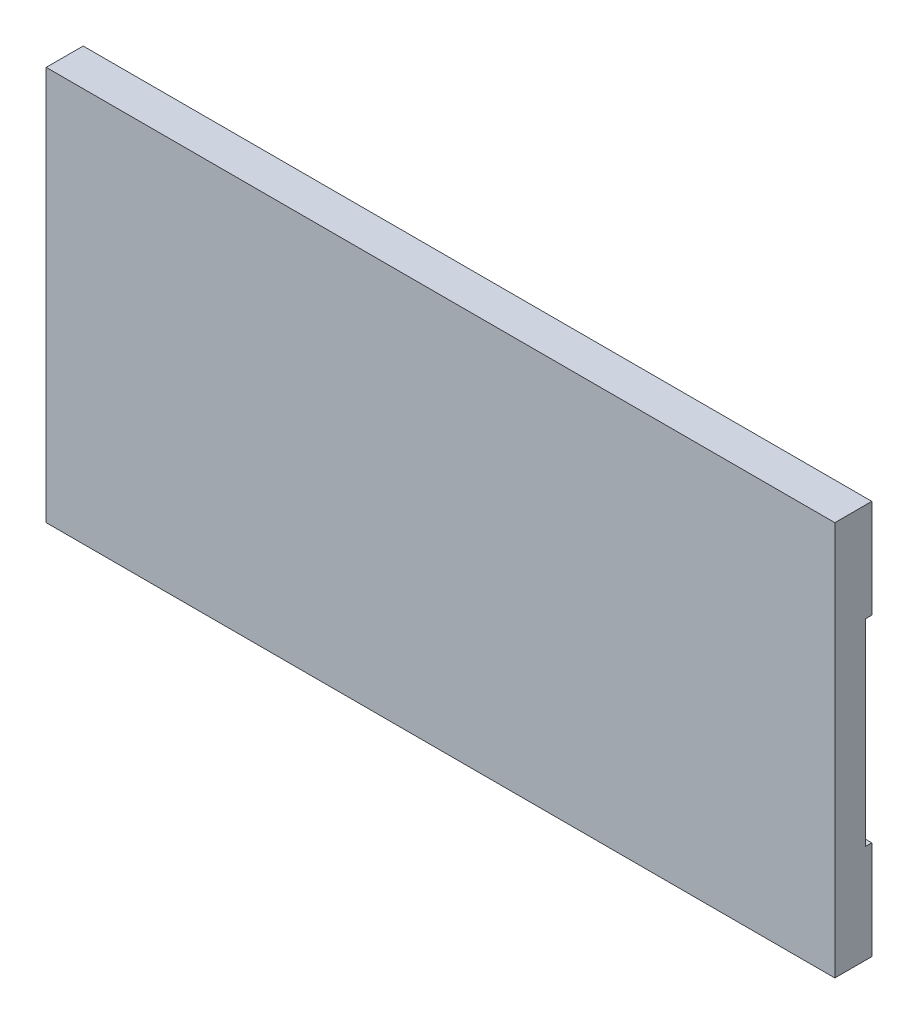
ISO-10303-21;
HEADER;
FILE_DESCRIPTION(('STEP AP214'),'2;1');
FILE_NAME('part.step','',(''),(''),'','','');
FILE_SCHEMA(('AUTOMOTIVE_DESIGN { 1 0 10303 214 1 1 1 1 }'));
ENDSEC;
DATA;
#1=APPLICATION_CONTEXT('core data for automotive mechanical design processes');
#2=APPLICATION_PROTOCOL_DEFINITION('international standard','automotive_design',2000,#1);
#3=PRODUCT_CONTEXT('',#1,'mechanical');
#4=PRODUCT('Part','Part','',(#3));
#5=PRODUCT_RELATED_PRODUCT_CATEGORY('part','',(#4));
#6=PRODUCT_DEFINITION_FORMATION('','',#4);
#7=PRODUCT_DEFINITION_CONTEXT('part definition',#1,'design');
#8=PRODUCT_DEFINITION('design','',#6,#7);
#9=PRODUCT_DEFINITION_SHAPE('','',#8);
#10=(LENGTH_UNIT() NAMED_UNIT(*) SI_UNIT(.MILLI.,.METRE.));
#11=(NAMED_UNIT(*) PLANE_ANGLE_UNIT() SI_UNIT($,.RADIAN.));
#12=(NAMED_UNIT(*) SI_UNIT($,.STERADIAN.) SOLID_ANGLE_UNIT());
#13=UNCERTAINTY_MEASURE_WITH_UNIT(LENGTH_MEASURE(1.E-05),#10,'distance_accuracy_value','');
#14=(GEOMETRIC_REPRESENTATION_CONTEXT(3) GLOBAL_UNCERTAINTY_ASSIGNED_CONTEXT((#13)) GLOBAL_UNIT_ASSIGNED_CONTEXT((#10,
#11,#12)) REPRESENTATION_CONTEXT('',''));
#15=CARTESIAN_POINT('',(0.,0.,0.));
#16=DIRECTION('',(0.,0.,1.));
#17=DIRECTION('',(1.,0.,0.));
#18=AXIS2_PLACEMENT_3D('',#15,#16,#17);
#19=CARTESIAN_POINT('',(0.,0.,0.));
#20=DIRECTION('',(0.,0.,-1.));
#21=DIRECTION('',(-1.,0.,0.));
#22=AXIS2_PLACEMENT_3D('',#19,#20,#21);
#23=PLANE('',#22);
#24=DIRECTION('',(1.,0.,0.));
#25=VECTOR('',#24,1.);
#26=CARTESIAN_POINT('',(0.,25.4,0.));
#27=LINE('',#26,#25);
#28=CARTESIAN_POINT('',(0.,25.4,0.));
#29=VERTEX_POINT('',#28);
#30=CARTESIAN_POINT('',(203.2,25.4,0.));
#31=VERTEX_POINT('',#30);
#32=EDGE_CURVE('E152',#29,#31,#27,.T.);
#33=ORIENTED_EDGE('',*,*,#32,.T.);
#34=DIRECTION('',(0.,1.,0.));
#35=VECTOR('',#34,1.);
#36=CARTESIAN_POINT('',(203.2,0.,0.));
#37=LINE('',#36,#35);
#38=CARTESIAN_POINT('',(203.2,0.,0.));
#39=VERTEX_POINT('',#38);
#40=EDGE_CURVE('E132',#39,#31,#37,.T.);
#41=ORIENTED_EDGE('',*,*,#40,.F.);
#42=DIRECTION('',(1.,0.,0.));
#43=VECTOR('',#42,1.);
#44=CARTESIAN_POINT('',(0.,0.,0.));
#45=LINE('',#44,#43);
#46=CARTESIAN_POINT('',(0.,0.,0.));
#47=VERTEX_POINT('',#46);
#48=EDGE_CURVE('E133',#47,#39,#45,.T.);
#49=ORIENTED_EDGE('',*,*,#48,.F.);
#50=DIRECTION('',(0.,-1.,0.));
#51=VECTOR('',#50,1.);
#52=CARTESIAN_POINT('',(0.,0.,0.));
#53=LINE('',#52,#51);
#54=EDGE_CURVE('E153',#29,#47,#53,.T.);
#55=ORIENTED_EDGE('',*,*,#54,.F.);
#56=EDGE_LOOP('',(#33,#41,#49,#55));
#57=FACE_BOUND('',#56,.T.);
#58=ADVANCED_FACE('F38',(#57),#23,.T.);
#59=CARTESIAN_POINT('',(0.,0.,9.525));
#60=DIRECTION('',(1.,0.,0.));
#61=DIRECTION('',(0.,0.,-1.));
#62=AXIS2_PLACEMENT_3D('',#59,#60,#61);
#63=PLANE('',#62);
#64=DIRECTION('',(0.,-1.,0.));
#65=VECTOR('',#64,1.);
#66=CARTESIAN_POINT('',(0.,76.2,1.5875));
#67=LINE('',#66,#65);
#68=CARTESIAN_POINT('',(0.,76.2,1.5875));
#69=VERTEX_POINT('',#68);
#70=CARTESIAN_POINT('',(0.,25.4,1.58749999999999));
#71=VERTEX_POINT('',#70);
#72=EDGE_CURVE('E267',#69,#71,#67,.T.);
#73=ORIENTED_EDGE('',*,*,#72,.T.);
#74=DIRECTION('',(0.,0.,-1.));
#75=VECTOR('',#74,1.);
#76=CARTESIAN_POINT('',(0.,25.4,0.));
#77=LINE('',#76,#75);
#78=EDGE_CURVE('E120',#71,#29,#77,.T.);
#79=ORIENTED_EDGE('',*,*,#78,.T.);
#80=ORIENTED_EDGE('',*,*,#54,.T.);
#81=DIRECTION('',(0.,0.,-1.));
#82=VECTOR('',#81,1.);
#83=CARTESIAN_POINT('',(0.,0.,9.525));
#84=LINE('',#83,#82);
#85=CARTESIAN_POINT('',(0.,0.,9.525));
#86=VERTEX_POINT('',#85);
#87=EDGE_CURVE('E11',#86,#47,#84,.T.);
#88=ORIENTED_EDGE('',*,*,#87,.F.);
#89=DIRECTION('',(0.,-1.,0.));
#90=VECTOR('',#89,1.);
#91=CARTESIAN_POINT('',(0.,0.,9.525));
#92=LINE('',#91,#90);
#93=CARTESIAN_POINT('',(0.,101.6,9.525));
#94=VERTEX_POINT('',#93);
#95=EDGE_CURVE('E140',#94,#86,#92,.T.);
#96=ORIENTED_EDGE('',*,*,#95,.F.);
#97=DIRECTION('',(0.,0.,-1.));
#98=VECTOR('',#97,1.);
#99=CARTESIAN_POINT('',(0.,101.6,9.525));
#100=LINE('',#99,#98);
#101=CARTESIAN_POINT('',(0.,101.6,0.));
#102=VERTEX_POINT('',#101);
#103=EDGE_CURVE('E141',#94,#102,#100,.T.);
#104=ORIENTED_EDGE('',*,*,#103,.T.);
#105=CARTESIAN_POINT('',(0.,76.2,0.));
#106=VERTEX_POINT('',#105);
#107=EDGE_CURVE('E135',#102,#106,#53,.T.);
#108=ORIENTED_EDGE('',*,*,#107,.T.);
#109=DIRECTION('',(0.,0.,1.));
#110=VECTOR('',#109,1.);
#111=CARTESIAN_POINT('',(0.,76.2,0.));
#112=LINE('',#111,#110);
#113=EDGE_CURVE('E53',#106,#69,#112,.T.);
#114=ORIENTED_EDGE('',*,*,#113,.T.);
#115=EDGE_LOOP('',(#73,#79,#80,#88,#96,#104,#108,#114));
#116=FACE_BOUND('',#115,.T.);
#117=ADVANCED_FACE('F40',(#116),#63,.F.);
#118=CARTESIAN_POINT('',(0.,0.,9.525));
#119=DIRECTION('',(0.,1.,0.));
#120=DIRECTION('',(0.,0.,1.));
#121=AXIS2_PLACEMENT_3D('',#118,#119,#120);
#122=PLANE('',#121);
#123=ORIENTED_EDGE('',*,*,#48,.T.);
#124=DIRECTION('',(0.,0.,-1.));
#125=VECTOR('',#124,1.);
#126=CARTESIAN_POINT('',(203.2,0.,9.525));
#127=LINE('',#126,#125);
#128=CARTESIAN_POINT('',(203.2,0.,9.525));
#129=VERTEX_POINT('',#128);
#130=EDGE_CURVE('E46',#129,#39,#127,.T.);
#131=ORIENTED_EDGE('',*,*,#130,.F.);
#132=DIRECTION('',(1.,0.,0.));
#133=VECTOR('',#132,1.);
#134=CARTESIAN_POINT('',(0.,0.,9.525));
#135=LINE('',#134,#133);
#136=EDGE_CURVE('E90',#86,#129,#135,.T.);
#137=ORIENTED_EDGE('',*,*,#136,.F.);
#138=ORIENTED_EDGE('',*,*,#87,.T.);
#139=EDGE_LOOP('',(#123,#131,#137,#138));
#140=FACE_BOUND('',#139,.T.);
#141=ADVANCED_FACE('F180',(#140),#122,.F.);
#142=CARTESIAN_POINT('',(203.2,0.,9.525));
#143=DIRECTION('',(-1.,0.,0.));
#144=DIRECTION('',(0.,0.,1.));
#145=AXIS2_PLACEMENT_3D('',#142,#143,#144);
#146=PLANE('',#145);
#147=ORIENTED_EDGE('',*,*,#40,.T.);
#148=DIRECTION('',(0.,0.,-1.));
#149=VECTOR('',#148,1.);
#150=CARTESIAN_POINT('',(203.2,25.4,0.));
#151=LINE('',#150,#149);
#152=CARTESIAN_POINT('',(203.2,25.4,1.58749999999999));
#153=VERTEX_POINT('',#152);
#154=EDGE_CURVE('E268',#153,#31,#151,.T.);
#155=ORIENTED_EDGE('',*,*,#154,.F.);
#156=DIRECTION('',(0.,-1.,0.));
#157=VECTOR('',#156,1.);
#158=CARTESIAN_POINT('',(203.2,76.2,1.5875));
#159=LINE('',#158,#157);
#160=CARTESIAN_POINT('',(203.2,76.2,1.5875));
#161=VERTEX_POINT('',#160);
#162=EDGE_CURVE('E129',#161,#153,#159,.T.);
#163=ORIENTED_EDGE('',*,*,#162,.F.);
#164=DIRECTION('',(0.,0.,1.));
#165=VECTOR('',#164,1.);
#166=CARTESIAN_POINT('',(203.2,76.2,0.));
#167=LINE('',#166,#165);
#168=CARTESIAN_POINT('',(203.2,76.2,0.));
#169=VERTEX_POINT('',#168);
#170=EDGE_CURVE('E113',#169,#161,#167,.T.);
#171=ORIENTED_EDGE('',*,*,#170,.F.);
#172=CARTESIAN_POINT('',(203.2,101.6,0.));
#173=VERTEX_POINT('',#172);
#174=EDGE_CURVE('E126',#169,#173,#37,.T.);
#175=ORIENTED_EDGE('',*,*,#174,.T.);
#176=DIRECTION('',(0.,0.,-1.));
#177=VECTOR('',#176,1.);
#178=CARTESIAN_POINT('',(203.2,101.6,9.525));
#179=LINE('',#178,#177);
#180=CARTESIAN_POINT('',(203.2,101.6,9.525));
#181=VERTEX_POINT('',#180);
#182=EDGE_CURVE('E143',#181,#173,#179,.T.);
#183=ORIENTED_EDGE('',*,*,#182,.F.);
#184=DIRECTION('',(0.,1.,0.));
#185=VECTOR('',#184,1.);
#186=CARTESIAN_POINT('',(203.2,0.,9.525));
#187=LINE('',#186,#185);
#188=EDGE_CURVE('E147',#129,#181,#187,.T.);
#189=ORIENTED_EDGE('',*,*,#188,.F.);
#190=ORIENTED_EDGE('',*,*,#130,.T.);
#191=EDGE_LOOP('',(#147,#155,#163,#171,#175,#183,#189,#190));
#192=FACE_BOUND('',#191,.T.);
#193=ADVANCED_FACE('F124',(#192),#146,.F.);
#194=CARTESIAN_POINT('',(0.,101.6,9.525));
#195=DIRECTION('',(0.,-1.,0.));
#196=DIRECTION('',(0.,0.,-1.));
#197=AXIS2_PLACEMENT_3D('',#194,#195,#196);
#198=PLANE('',#197);
#199=DIRECTION('',(-1.,0.,0.));
#200=VECTOR('',#199,1.);
#201=CARTESIAN_POINT('',(0.,101.6,0.));
#202=LINE('',#201,#200);
#203=EDGE_CURVE('E83',#173,#102,#202,.T.);
#204=ORIENTED_EDGE('',*,*,#203,.T.);
#205=ORIENTED_EDGE('',*,*,#103,.F.);
#206=DIRECTION('',(-1.,0.,0.));
#207=VECTOR('',#206,1.);
#208=CARTESIAN_POINT('',(0.,101.6,9.525));
#209=LINE('',#208,#207);
#210=EDGE_CURVE('E62',#181,#94,#209,.T.);
#211=ORIENTED_EDGE('',*,*,#210,.F.);
#212=ORIENTED_EDGE('',*,*,#182,.T.);
#213=EDGE_LOOP('',(#204,#205,#211,#212));
#214=FACE_BOUND('',#213,.T.);
#215=ADVANCED_FACE('F171',(#214),#198,.F.);
#216=CARTESIAN_POINT('',(0.,0.,9.525));
#217=DIRECTION('',(0.,0.,-1.));
#218=DIRECTION('',(-1.,0.,0.));
#219=AXIS2_PLACEMENT_3D('',#216,#217,#218);
#220=PLANE('',#219);
#221=ORIENTED_EDGE('',*,*,#95,.T.);
#222=ORIENTED_EDGE('',*,*,#136,.T.);
#223=ORIENTED_EDGE('',*,*,#188,.T.);
#224=ORIENTED_EDGE('',*,*,#210,.T.);
#225=EDGE_LOOP('',(#221,#222,#223,#224));
#226=FACE_BOUND('',#225,.T.);
#227=ADVANCED_FACE('F173',(#226),#220,.F.);
#228=DIRECTION('',(1.,0.,0.));
#229=VECTOR('',#228,1.);
#230=CARTESIAN_POINT('',(0.,76.2,0.));
#231=LINE('',#230,#229);
#232=EDGE_CURVE('E110',#106,#169,#231,.T.);
#233=ORIENTED_EDGE('',*,*,#232,.F.);
#234=ORIENTED_EDGE('',*,*,#107,.F.);
#235=ORIENTED_EDGE('',*,*,#203,.F.);
#236=ORIENTED_EDGE('',*,*,#174,.F.);
#237=EDGE_LOOP('',(#233,#234,#235,#236));
#238=FACE_BOUND('',#237,.T.);
#239=ADVANCED_FACE('F131',(#238),#23,.T.);
#240=CARTESIAN_POINT('',(0.,25.4,0.));
#241=DIRECTION('',(0.,-1.,0.));
#242=DIRECTION('',(0.,0.,-1.));
#243=AXIS2_PLACEMENT_3D('',#240,#241,#242);
#244=PLANE('',#243);
#245=ORIENTED_EDGE('',*,*,#32,.F.);
#246=ORIENTED_EDGE('',*,*,#78,.F.);
#247=DIRECTION('',(1.,0.,0.));
#248=VECTOR('',#247,1.);
#249=CARTESIAN_POINT('',(0.,25.4,1.58749999999999));
#250=LINE('',#249,#248);
#251=EDGE_CURVE('E157',#71,#153,#250,.T.);
#252=ORIENTED_EDGE('',*,*,#251,.T.);
#253=ORIENTED_EDGE('',*,*,#154,.T.);
#254=EDGE_LOOP('',(#245,#246,#252,#253));
#255=FACE_BOUND('',#254,.T.);
#256=ADVANCED_FACE('F188',(#255),#244,.F.);
#257=CARTESIAN_POINT('',(0.,76.2,1.5875));
#258=DIRECTION('',(0.,0.,1.));
#259=DIRECTION('',(0.,-1.,0.));
#260=AXIS2_PLACEMENT_3D('',#257,#258,#259);
#261=PLANE('',#260);
#262=ORIENTED_EDGE('',*,*,#251,.F.);
#263=ORIENTED_EDGE('',*,*,#72,.F.);
#264=DIRECTION('',(1.,0.,0.));
#265=VECTOR('',#264,1.);
#266=CARTESIAN_POINT('',(0.,76.2,1.5875));
#267=LINE('',#266,#265);
#268=EDGE_CURVE('E119',#69,#161,#267,.T.);
#269=ORIENTED_EDGE('',*,*,#268,.T.);
#270=ORIENTED_EDGE('',*,*,#162,.T.);
#271=EDGE_LOOP('',(#262,#263,#269,#270));
#272=FACE_BOUND('',#271,.T.);
#273=ADVANCED_FACE('F192',(#272),#261,.F.);
#274=CARTESIAN_POINT('',(0.,76.2,0.));
#275=DIRECTION('',(0.,1.,0.));
#276=DIRECTION('',(0.,0.,1.));
#277=AXIS2_PLACEMENT_3D('',#274,#275,#276);
#278=PLANE('',#277);
#279=ORIENTED_EDGE('',*,*,#268,.F.);
#280=ORIENTED_EDGE('',*,*,#113,.F.);
#281=ORIENTED_EDGE('',*,*,#232,.T.);
#282=ORIENTED_EDGE('',*,*,#170,.T.);
#283=EDGE_LOOP('',(#279,#280,#281,#282));
#284=FACE_BOUND('',#283,.T.);
#285=ADVANCED_FACE('F112',(#284),#278,.F.);
#286=CLOSED_SHELL('',(#58,#117,#141,#193,#215,#227,#239,#256,#273,#285));
#287=MANIFOLD_SOLID_BREP('B2',#286);
#288=ADVANCED_BREP_SHAPE_REPRESENTATION('',(#18,#287),#14);
#289=SHAPE_DEFINITION_REPRESENTATION(#9,#288);
ENDSEC;
END-ISO-10303-21;
